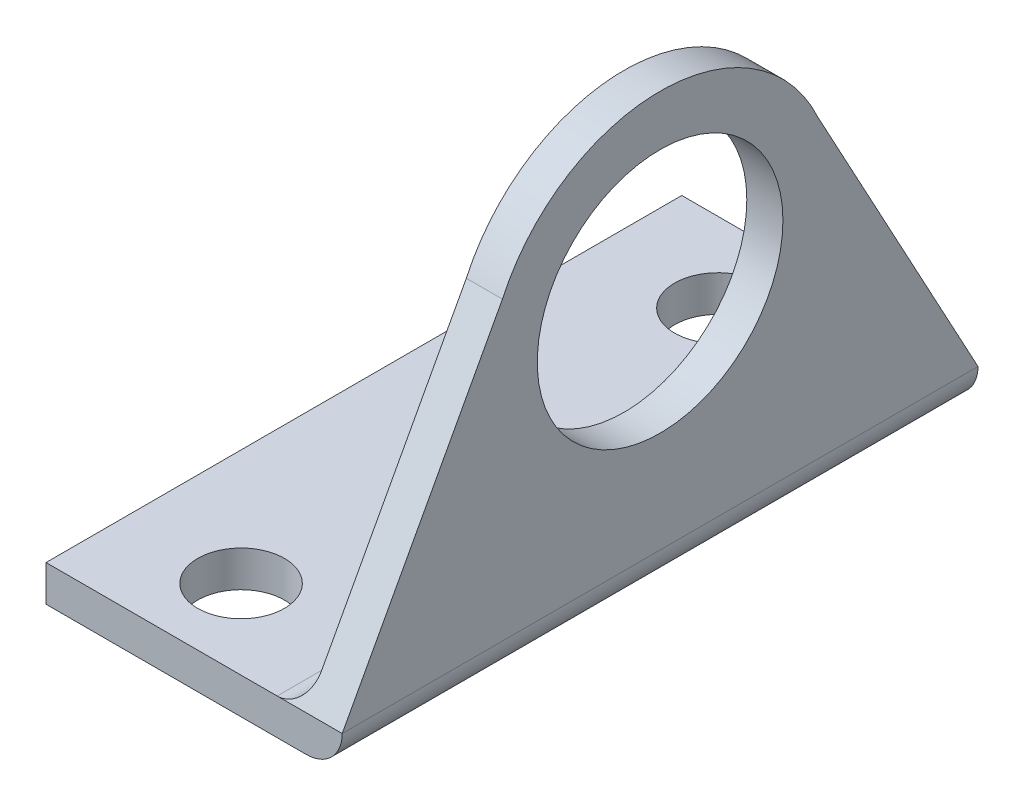
ISO-10303-21;
HEADER;
FILE_DESCRIPTION(('STEP AP214'),'2;1');
FILE_NAME('part.step','',(''),(''),'','','');
FILE_SCHEMA(('AUTOMOTIVE_DESIGN { 1 0 10303 214 1 1 1 1 }'));
ENDSEC;
DATA;
#1=APPLICATION_CONTEXT('core data for automotive mechanical design processes');
#2=APPLICATION_PROTOCOL_DEFINITION('international standard','automotive_design',2000,#1);
#3=PRODUCT_CONTEXT('',#1,'mechanical');
#4=PRODUCT('Part','Part','',(#3));
#5=PRODUCT_RELATED_PRODUCT_CATEGORY('part','',(#4));
#6=PRODUCT_DEFINITION_FORMATION('','',#4);
#7=PRODUCT_DEFINITION_CONTEXT('part definition',#1,'design');
#8=PRODUCT_DEFINITION('design','',#6,#7);
#9=PRODUCT_DEFINITION_SHAPE('','',#8);
#10=(LENGTH_UNIT() NAMED_UNIT(*) SI_UNIT(.MILLI.,.METRE.));
#11=(NAMED_UNIT(*) PLANE_ANGLE_UNIT() SI_UNIT($,.RADIAN.));
#12=(NAMED_UNIT(*) SI_UNIT($,.STERADIAN.) SOLID_ANGLE_UNIT());
#13=UNCERTAINTY_MEASURE_WITH_UNIT(LENGTH_MEASURE(1.E-05),#10,'distance_accuracy_value','');
#14=(GEOMETRIC_REPRESENTATION_CONTEXT(3) GLOBAL_UNCERTAINTY_ASSIGNED_CONTEXT((#13)) GLOBAL_UNIT_ASSIGNED_CONTEXT((#10,
#11,#12)) REPRESENTATION_CONTEXT('',''));
#15=CARTESIAN_POINT('',(0.,0.,0.));
#16=DIRECTION('',(0.,0.,1.));
#17=DIRECTION('',(1.,0.,0.));
#18=AXIS2_PLACEMENT_3D('',#15,#16,#17);
#19=CARTESIAN_POINT('',(9.,0.,0.));
#20=DIRECTION('',(-1.,0.,0.));
#21=DIRECTION('',(0.,0.,1.));
#22=AXIS2_PLACEMENT_3D('',#19,#20,#21);
#23=PLANE('',#22);
#24=CARTESIAN_POINT('',(9.,18.,0.));
#25=DIRECTION('',(1.,0.,0.));
#26=DIRECTION('',(0.,0.,-1.));
#27=AXIS2_PLACEMENT_3D('',#24,#25,#26);
#28=CIRCLE('',#27,8.5);
#29=CARTESIAN_POINT('',(9.,18.,-8.5));
#30=VERTEX_POINT('',#29);
#31=EDGE_CURVE('E235',#30,#30,#28,.T.);
#32=ORIENTED_EDGE('',*,*,#31,.T.);
#33=EDGE_LOOP('',(#32));
#34=FACE_BOUND('',#33,.T.);
#35=DIRECTION('',(0.,0.879510938601281,0.475878670335931));
#36=VECTOR('',#35,1.);
#37=CARTESIAN_POINT('',(9.,9.77404218436638,-18.0642200446435));
#38=LINE('',#37,#36);
#39=CARTESIAN_POINT('',(9.,4.5,-20.9178561642616));
#40=VERTEX_POINT('',#39);
#41=CARTESIAN_POINT('',(9.,22.9916533560188,-10.9125418183482));
#42=VERTEX_POINT('',#41);
#43=EDGE_CURVE('E141',#40,#42,#38,.T.);
#44=ORIENTED_EDGE('',*,*,#43,.F.);
#45=DIRECTION('',(0.,0.,-1.));
#46=VECTOR('',#45,1.);
#47=CARTESIAN_POINT('',(9.,4.5,22.));
#48=LINE('',#47,#46);
#49=CARTESIAN_POINT('',(9.,4.5,20.9178561642616));
#50=VERTEX_POINT('',#49);
#51=EDGE_CURVE('E91',#40,#50,#48,.F.);
#52=ORIENTED_EDGE('',*,*,#51,.T.);
#53=DIRECTION('',(0.,0.879510938601281,-0.475878670335931));
#54=VECTOR('',#53,1.);
#55=CARTESIAN_POINT('',(9.,9.77404218436638,18.0642200446435));
#56=LINE('',#55,#54);
#57=CARTESIAN_POINT('',(9.,22.9916533560188,10.9125418183482));
#58=VERTEX_POINT('',#57);
#59=EDGE_CURVE('E151',#50,#58,#56,.T.);
#60=ORIENTED_EDGE('',*,*,#59,.T.);
#61=CARTESIAN_POINT('',(9.,18.,0.));
#62=DIRECTION('',(1.,0.,0.));
#63=DIRECTION('',(0.,0.,-1.));
#64=AXIS2_PLACEMENT_3D('',#61,#62,#63);
#65=CIRCLE('',#64,12.0000071734917);
#66=EDGE_CURVE('E150',#42,#58,#65,.T.);
#67=ORIENTED_EDGE('',*,*,#66,.F.);
#68=EDGE_LOOP('',(#44,#52,#60,#67));
#69=FACE_BOUND('',#68,.T.);
#70=ADVANCED_FACE('F67',(#34,#69),#23,.T.);
#71=CARTESIAN_POINT('',(11.5,0.,0.));
#72=DIRECTION('',(-1.,0.,0.));
#73=DIRECTION('',(0.,0.,1.));
#74=AXIS2_PLACEMENT_3D('',#71,#72,#73);
#75=PLANE('',#74);
#76=CARTESIAN_POINT('',(11.5,18.,0.));
#77=DIRECTION('',(1.,0.,0.));
#78=DIRECTION('',(0.,0.,-1.));
#79=AXIS2_PLACEMENT_3D('',#76,#77,#78);
#80=CIRCLE('',#79,8.5);
#81=CARTESIAN_POINT('',(11.5,18.,-8.5));
#82=VERTEX_POINT('',#81);
#83=EDGE_CURVE('E237',#82,#82,#80,.T.);
#84=ORIENTED_EDGE('',*,*,#83,.F.);
#85=EDGE_LOOP('',(#84));
#86=FACE_BOUND('',#85,.T.);
#87=DIRECTION('',(0.,0.879510938601281,-0.475878670335931));
#88=VECTOR('',#87,1.);
#89=CARTESIAN_POINT('',(11.5,9.77404218436638,18.0642200446435));
#90=LINE('',#89,#88);
#91=CARTESIAN_POINT('',(11.5,2.5,22.));
#92=VERTEX_POINT('',#91);
#93=CARTESIAN_POINT('',(11.5,22.9916533560188,10.9125418183482));
#94=VERTEX_POINT('',#93);
#95=EDGE_CURVE('E154',#92,#94,#90,.T.);
#96=ORIENTED_EDGE('',*,*,#95,.F.);
#97=DIRECTION('',(0.,0.,-1.));
#98=VECTOR('',#97,1.);
#99=CARTESIAN_POINT('',(11.5,2.5,0.));
#100=LINE('',#99,#98);
#101=CARTESIAN_POINT('',(11.5,2.49999999999997,-22.));
#102=VERTEX_POINT('',#101);
#103=EDGE_CURVE('E202',#92,#102,#100,.T.);
#104=ORIENTED_EDGE('',*,*,#103,.T.);
#105=DIRECTION('',(0.,0.879510938601281,0.475878670335931));
#106=VECTOR('',#105,1.);
#107=CARTESIAN_POINT('',(11.5,9.77404218436638,-18.0642200446435));
#108=LINE('',#107,#106);
#109=CARTESIAN_POINT('',(11.5,22.9916533560188,-10.9125418183482));
#110=VERTEX_POINT('',#109);
#111=EDGE_CURVE('E147',#102,#110,#108,.T.);
#112=ORIENTED_EDGE('',*,*,#111,.T.);
#113=CARTESIAN_POINT('',(11.5,18.,0.));
#114=DIRECTION('',(1.,0.,0.));
#115=DIRECTION('',(0.,0.,-1.));
#116=AXIS2_PLACEMENT_3D('',#113,#114,#115);
#117=CIRCLE('',#116,12.0000071734917);
#118=EDGE_CURVE('E158',#110,#94,#117,.T.);
#119=ORIENTED_EDGE('',*,*,#118,.T.);
#120=EDGE_LOOP('',(#96,#104,#112,#119));
#121=FACE_BOUND('',#120,.T.);
#122=ADVANCED_FACE('F234',(#86,#121),#75,.F.);
#123=CARTESIAN_POINT('',(9.,2.5,-22.));
#124=DIRECTION('',(0.,0.,1.));
#125=DIRECTION('',(1.,0.,0.));
#126=AXIS2_PLACEMENT_3D('',#123,#124,#125);
#127=PLANE('',#126);
#128=DIRECTION('',(1.,0.,0.));
#129=VECTOR('',#128,1.);
#130=CARTESIAN_POINT('',(9.,2.49999999999997,-22.));
#131=LINE('',#130,#129);
#132=CARTESIAN_POINT('',(7.,2.49999999999997,-22.));
#133=VERTEX_POINT('',#132);
#134=EDGE_CURVE('E102',#133,#102,#131,.T.);
#135=ORIENTED_EDGE('',*,*,#134,.T.);
#136=CARTESIAN_POINT('',(9.,2.5,-22.));
#137=DIRECTION('',(0.,0.,1.));
#138=DIRECTION('',(1.,0.,0.));
#139=AXIS2_PLACEMENT_3D('',#136,#137,#138);
#140=CIRCLE('',#139,2.5);
#141=CARTESIAN_POINT('',(9.,0.,-22.));
#142=VERTEX_POINT('',#141);
#143=EDGE_CURVE('E205',#102,#142,#140,.F.);
#144=ORIENTED_EDGE('',*,*,#143,.T.);
#145=DIRECTION('',(-1.,0.,0.));
#146=VECTOR('',#145,1.);
#147=CARTESIAN_POINT('',(9.,0.,-22.));
#148=LINE('',#147,#146);
#149=CARTESIAN_POINT('',(-9.,0.,-22.));
#150=VERTEX_POINT('',#149);
#151=EDGE_CURVE('E187',#142,#150,#148,.T.);
#152=ORIENTED_EDGE('',*,*,#151,.T.);
#153=DIRECTION('',(0.,-1.,0.));
#154=VECTOR('',#153,1.);
#155=CARTESIAN_POINT('',(-9.,2.5,-22.));
#156=LINE('',#155,#154);
#157=CARTESIAN_POINT('',(-9.,2.5,-22.));
#158=VERTEX_POINT('',#157);
#159=EDGE_CURVE('E191',#158,#150,#156,.T.);
#160=ORIENTED_EDGE('',*,*,#159,.F.);
#161=DIRECTION('',(-1.,0.,0.));
#162=VECTOR('',#161,1.);
#163=CARTESIAN_POINT('',(9.,2.5,-22.));
#164=LINE('',#163,#162);
#165=EDGE_CURVE('E189',#133,#158,#164,.T.);
#166=ORIENTED_EDGE('',*,*,#165,.F.);
#167=EDGE_LOOP('',(#135,#144,#152,#160,#166));
#168=FACE_BOUND('',#167,.T.);
#169=ADVANCED_FACE('F221',(#168),#127,.F.);
#170=CARTESIAN_POINT('',(-9.,2.5,22.));
#171=DIRECTION('',(1.,0.,0.));
#172=DIRECTION('',(0.,0.,-1.));
#173=AXIS2_PLACEMENT_3D('',#170,#171,#172);
#174=PLANE('',#173);
#175=DIRECTION('',(0.,0.,1.));
#176=VECTOR('',#175,1.);
#177=CARTESIAN_POINT('',(-9.,0.,22.));
#178=LINE('',#177,#176);
#179=CARTESIAN_POINT('',(-9.,0.,22.));
#180=VERTEX_POINT('',#179);
#181=EDGE_CURVE('E174',#150,#180,#178,.T.);
#182=ORIENTED_EDGE('',*,*,#181,.T.);
#183=DIRECTION('',(0.,-1.,0.));
#184=VECTOR('',#183,1.);
#185=CARTESIAN_POINT('',(-9.,2.5,22.));
#186=LINE('',#185,#184);
#187=CARTESIAN_POINT('',(-9.,2.5,22.));
#188=VERTEX_POINT('',#187);
#189=EDGE_CURVE('E199',#188,#180,#186,.T.);
#190=ORIENTED_EDGE('',*,*,#189,.F.);
#191=DIRECTION('',(0.,0.,1.));
#192=VECTOR('',#191,1.);
#193=CARTESIAN_POINT('',(-9.,2.5,22.));
#194=LINE('',#193,#192);
#195=EDGE_CURVE('E183',#158,#188,#194,.T.);
#196=ORIENTED_EDGE('',*,*,#195,.F.);
#197=ORIENTED_EDGE('',*,*,#159,.T.);
#198=EDGE_LOOP('',(#182,#190,#196,#197));
#199=FACE_BOUND('',#198,.T.);
#200=ADVANCED_FACE('F226',(#199),#174,.F.);
#201=CARTESIAN_POINT('',(9.,2.5,22.));
#202=DIRECTION('',(0.,0.,-1.));
#203=DIRECTION('',(-1.,0.,0.));
#204=AXIS2_PLACEMENT_3D('',#201,#202,#203);
#205=PLANE('',#204);
#206=DIRECTION('',(1.,0.,0.));
#207=VECTOR('',#206,1.);
#208=CARTESIAN_POINT('',(9.,0.,22.));
#209=LINE('',#208,#207);
#210=CARTESIAN_POINT('',(9.,0.,22.));
#211=VERTEX_POINT('',#210);
#212=EDGE_CURVE('E194',#180,#211,#209,.T.);
#213=ORIENTED_EDGE('',*,*,#212,.T.);
#214=CARTESIAN_POINT('',(9.,2.5,22.));
#215=DIRECTION('',(0.,0.,-1.));
#216=DIRECTION('',(-1.,0.,0.));
#217=AXIS2_PLACEMENT_3D('',#214,#215,#216);
#218=CIRCLE('',#217,2.5);
#219=EDGE_CURVE('E208',#211,#92,#218,.F.);
#220=ORIENTED_EDGE('',*,*,#219,.T.);
#221=DIRECTION('',(1.,0.,0.));
#222=VECTOR('',#221,1.);
#223=CARTESIAN_POINT('',(9.,2.5,22.));
#224=LINE('',#223,#222);
#225=CARTESIAN_POINT('',(7.,2.5,22.));
#226=VERTEX_POINT('',#225);
#227=EDGE_CURVE('E82',#226,#92,#224,.T.);
#228=ORIENTED_EDGE('',*,*,#227,.F.);
#229=DIRECTION('',(1.,0.,0.));
#230=VECTOR('',#229,1.);
#231=CARTESIAN_POINT('',(9.,2.5,22.));
#232=LINE('',#231,#230);
#233=EDGE_CURVE('E186',#188,#226,#232,.T.);
#234=ORIENTED_EDGE('',*,*,#233,.F.);
#235=ORIENTED_EDGE('',*,*,#189,.T.);
#236=EDGE_LOOP('',(#213,#220,#228,#234,#235));
#237=FACE_BOUND('',#236,.T.);
#238=ADVANCED_FACE('F227',(#237),#205,.F.);
#239=CARTESIAN_POINT('',(0.,2.5,0.));
#240=DIRECTION('',(0.,1.,0.));
#241=DIRECTION('',(0.,0.,1.));
#242=AXIS2_PLACEMENT_3D('',#239,#240,#241);
#243=PLANE('',#242);
#244=CARTESIAN_POINT('',(-1.,2.5,16.5));
#245=DIRECTION('',(0.,1.,0.));
#246=DIRECTION('',(0.,0.,1.));
#247=AXIS2_PLACEMENT_3D('',#244,#245,#246);
#248=CIRCLE('',#247,3.);
#249=CARTESIAN_POINT('',(-1.,2.5,19.5));
#250=VERTEX_POINT('',#249);
#251=EDGE_CURVE('E175',#250,#250,#248,.T.);
#252=ORIENTED_EDGE('',*,*,#251,.F.);
#253=EDGE_LOOP('',(#252));
#254=FACE_BOUND('',#253,.T.);
#255=CARTESIAN_POINT('',(-1.,2.5,-16.5));
#256=DIRECTION('',(0.,1.,0.));
#257=DIRECTION('',(0.,0.,-1.));
#258=AXIS2_PLACEMENT_3D('',#255,#256,#257);
#259=CIRCLE('',#258,3.);
#260=CARTESIAN_POINT('',(-1.,2.5,-19.5));
#261=VERTEX_POINT('',#260);
#262=EDGE_CURVE('E169',#261,#261,#259,.T.);
#263=ORIENTED_EDGE('',*,*,#262,.F.);
#264=EDGE_LOOP('',(#263));
#265=FACE_BOUND('',#264,.T.);
#266=ORIENTED_EDGE('',*,*,#233,.T.);
#267=DIRECTION('',(0.,0.,-1.));
#268=VECTOR('',#267,1.);
#269=CARTESIAN_POINT('',(7.,2.5,-22.));
#270=LINE('',#269,#268);
#271=EDGE_CURVE('E210',#226,#133,#270,.T.);
#272=ORIENTED_EDGE('',*,*,#271,.T.);
#273=ORIENTED_EDGE('',*,*,#165,.T.);
#274=ORIENTED_EDGE('',*,*,#195,.T.);
#275=EDGE_LOOP('',(#266,#272,#273,#274));
#276=FACE_BOUND('',#275,.T.);
#277=ADVANCED_FACE('F216',(#254,#265,#276),#243,.T.);
#278=CARTESIAN_POINT('',(0.,0.,0.));
#279=DIRECTION('',(0.,1.,0.));
#280=DIRECTION('',(0.,0.,1.));
#281=AXIS2_PLACEMENT_3D('',#278,#279,#280);
#282=PLANE('',#281);
#283=CARTESIAN_POINT('',(-1.,0.,16.5));
#284=DIRECTION('',(0.,1.,0.));
#285=DIRECTION('',(0.,0.,1.));
#286=AXIS2_PLACEMENT_3D('',#283,#284,#285);
#287=CIRCLE('',#286,3.);
#288=CARTESIAN_POINT('',(-1.,0.,19.5));
#289=VERTEX_POINT('',#288);
#290=EDGE_CURVE('E171',#289,#289,#287,.T.);
#291=ORIENTED_EDGE('',*,*,#290,.T.);
#292=EDGE_LOOP('',(#291));
#293=FACE_BOUND('',#292,.T.);
#294=CARTESIAN_POINT('',(-1.,0.,-16.5));
#295=DIRECTION('',(0.,1.,0.));
#296=DIRECTION('',(0.,0.,-1.));
#297=AXIS2_PLACEMENT_3D('',#294,#295,#296);
#298=CIRCLE('',#297,3.);
#299=CARTESIAN_POINT('',(-1.,0.,-19.5));
#300=VERTEX_POINT('',#299);
#301=EDGE_CURVE('E178',#300,#300,#298,.T.);
#302=ORIENTED_EDGE('',*,*,#301,.T.);
#303=EDGE_LOOP('',(#302));
#304=FACE_BOUND('',#303,.T.);
#305=ORIENTED_EDGE('',*,*,#151,.F.);
#306=DIRECTION('',(0.,0.,-1.));
#307=VECTOR('',#306,1.);
#308=CARTESIAN_POINT('',(9.,0.,0.));
#309=LINE('',#308,#307);
#310=EDGE_CURVE('E110',#142,#211,#309,.F.);
#311=ORIENTED_EDGE('',*,*,#310,.T.);
#312=ORIENTED_EDGE('',*,*,#212,.F.);
#313=ORIENTED_EDGE('',*,*,#181,.F.);
#314=EDGE_LOOP('',(#305,#311,#312,#313));
#315=FACE_BOUND('',#314,.T.);
#316=ADVANCED_FACE('F264',(#293,#304,#315),#282,.F.);
#317=CARTESIAN_POINT('',(-1.,0.,-16.5));
#318=DIRECTION('',(0.,1.,0.));
#319=DIRECTION('',(0.,0.,1.));
#320=AXIS2_PLACEMENT_3D('',#317,#318,#319);
#321=CYLINDRICAL_SURFACE('',#320,3.);
#322=ORIENTED_EDGE('',*,*,#301,.F.);
#323=EDGE_LOOP('',(#322));
#324=FACE_BOUND('',#323,.T.);
#325=ORIENTED_EDGE('',*,*,#262,.T.);
#326=EDGE_LOOP('',(#325));
#327=FACE_BOUND('',#326,.T.);
#328=ADVANCED_FACE('F260',(#324,#327),#321,.F.);
#329=CARTESIAN_POINT('',(-1.,0.,16.5));
#330=DIRECTION('',(0.,1.,0.));
#331=DIRECTION('',(0.,0.,1.));
#332=AXIS2_PLACEMENT_3D('',#329,#330,#331);
#333=CYLINDRICAL_SURFACE('',#332,3.);
#334=ORIENTED_EDGE('',*,*,#290,.F.);
#335=EDGE_LOOP('',(#334));
#336=FACE_BOUND('',#335,.T.);
#337=ORIENTED_EDGE('',*,*,#251,.T.);
#338=EDGE_LOOP('',(#337));
#339=FACE_BOUND('',#338,.T.);
#340=ADVANCED_FACE('F257',(#336,#339),#333,.F.);
#341=CARTESIAN_POINT('',(9.,18.,0.));
#342=DIRECTION('',(1.,0.,0.));
#343=DIRECTION('',(0.,0.,-1.));
#344=AXIS2_PLACEMENT_3D('',#341,#342,#343);
#345=CYLINDRICAL_SURFACE('',#344,12.0000071734917);
#346=ORIENTED_EDGE('',*,*,#118,.F.);
#347=DIRECTION('',(1.,0.,0.));
#348=VECTOR('',#347,1.);
#349=CARTESIAN_POINT('',(9.,22.9916533560188,-10.9125418183482));
#350=LINE('',#349,#348);
#351=EDGE_CURVE('E145',#42,#110,#350,.T.);
#352=ORIENTED_EDGE('',*,*,#351,.F.);
#353=ORIENTED_EDGE('',*,*,#66,.T.);
#354=DIRECTION('',(1.,0.,0.));
#355=VECTOR('',#354,1.);
#356=CARTESIAN_POINT('',(9.,22.9916533560188,10.9125418183482));
#357=LINE('',#356,#355);
#358=EDGE_CURVE('E167',#58,#94,#357,.T.);
#359=ORIENTED_EDGE('',*,*,#358,.T.);
#360=EDGE_LOOP('',(#346,#352,#353,#359));
#361=FACE_BOUND('',#360,.T.);
#362=ADVANCED_FACE('F156',(#361),#345,.T.);
#363=CARTESIAN_POINT('',(9.,9.77404218436638,18.0642200446435));
#364=DIRECTION('',(0.,-0.475878670335931,-0.879510938601281));
#365=DIRECTION('',(0.,0.879510938601281,-0.475878670335931));
#366=AXIS2_PLACEMENT_3D('',#363,#364,#365);
#367=PLANE('',#366);
#368=ORIENTED_EDGE('',*,*,#95,.T.);
#369=ORIENTED_EDGE('',*,*,#358,.F.);
#370=ORIENTED_EDGE('',*,*,#59,.F.);
#371=CARTESIAN_POINT('',(7.,4.5,20.9178561642616));
#372=DIRECTION('',(0.,-0.475878670335931,-0.879510938601281));
#373=DIRECTION('',(0.,-0.879510938601281,0.475878670335931));
#374=AXIS2_PLACEMENT_3D('',#371,#372,#373);
#375=ELLIPSE('',#374,2.27399104686597,2.);
#376=EDGE_CURVE('E12',#50,#226,#375,.T.);
#377=ORIENTED_EDGE('',*,*,#376,.T.);
#378=ORIENTED_EDGE('',*,*,#227,.T.);
#379=EDGE_LOOP('',(#368,#369,#370,#377,#378));
#380=FACE_BOUND('',#379,.T.);
#381=ADVANCED_FACE('F285',(#380),#367,.F.);
#382=CARTESIAN_POINT('',(9.,9.77404218436638,-18.0642200446435));
#383=DIRECTION('',(0.,0.475878670335931,-0.879510938601281));
#384=DIRECTION('',(0.,0.879510938601281,0.475878670335931));
#385=AXIS2_PLACEMENT_3D('',#382,#383,#384);
#386=PLANE('',#385);
#387=ORIENTED_EDGE('',*,*,#111,.F.);
#388=ORIENTED_EDGE('',*,*,#134,.F.);
#389=CARTESIAN_POINT('',(7.,4.5,-20.9178561642616));
#390=DIRECTION('',(0.,0.475878670335931,-0.879510938601281));
#391=DIRECTION('',(0.,0.879510938601281,0.475878670335931));
#392=AXIS2_PLACEMENT_3D('',#389,#390,#391);
#393=ELLIPSE('',#392,2.27399104686597,2.);
#394=EDGE_CURVE('E75',#133,#40,#393,.F.);
#395=ORIENTED_EDGE('',*,*,#394,.T.);
#396=ORIENTED_EDGE('',*,*,#43,.T.);
#397=ORIENTED_EDGE('',*,*,#351,.T.);
#398=EDGE_LOOP('',(#387,#388,#395,#396,#397));
#399=FACE_BOUND('',#398,.T.);
#400=ADVANCED_FACE('F143',(#399),#386,.T.);
#401=CARTESIAN_POINT('',(9.,18.,0.));
#402=DIRECTION('',(1.,0.,0.));
#403=DIRECTION('',(0.,0.,-1.));
#404=AXIS2_PLACEMENT_3D('',#401,#402,#403);
#405=CYLINDRICAL_SURFACE('',#404,8.5);
#406=ORIENTED_EDGE('',*,*,#31,.F.);
#407=EDGE_LOOP('',(#406));
#408=FACE_BOUND('',#407,.T.);
#409=ORIENTED_EDGE('',*,*,#83,.T.);
#410=EDGE_LOOP('',(#409));
#411=FACE_BOUND('',#410,.T.);
#412=ADVANCED_FACE('F243',(#408,#411),#405,.F.);
#413=CARTESIAN_POINT('',(9.,2.5,0.));
#414=DIRECTION('',(0.,0.,-1.));
#415=DIRECTION('',(-1.,0.,0.));
#416=AXIS2_PLACEMENT_3D('',#413,#414,#415);
#417=CYLINDRICAL_SURFACE('',#416,2.5);
#418=ORIENTED_EDGE('',*,*,#219,.F.);
#419=ORIENTED_EDGE('',*,*,#310,.F.);
#420=ORIENTED_EDGE('',*,*,#143,.F.);
#421=ORIENTED_EDGE('',*,*,#103,.F.);
#422=EDGE_LOOP('',(#418,#419,#420,#421));
#423=FACE_BOUND('',#422,.T.);
#424=ADVANCED_FACE('F231',(#423),#417,.T.);
#425=CARTESIAN_POINT('',(7.,4.5,0.));
#426=DIRECTION('',(0.,0.,1.));
#427=DIRECTION('',(1.,0.,0.));
#428=AXIS2_PLACEMENT_3D('',#425,#426,#427);
#429=CYLINDRICAL_SURFACE('',#428,2.);
#430=ORIENTED_EDGE('',*,*,#376,.F.);
#431=ORIENTED_EDGE('',*,*,#51,.F.);
#432=ORIENTED_EDGE('',*,*,#394,.F.);
#433=ORIENTED_EDGE('',*,*,#271,.F.);
#434=EDGE_LOOP('',(#430,#431,#432,#433));
#435=FACE_BOUND('',#434,.T.);
#436=ADVANCED_FACE('F69',(#435),#429,.F.);
#437=CLOSED_SHELL('',(#70,#122,#169,#200,#238,#277,#316,#328,#340,#362,#381,#400,#412,#424,#436));
#438=MANIFOLD_SOLID_BREP('B2',#437);
#439=ADVANCED_BREP_SHAPE_REPRESENTATION('',(#18,#438),#14);
#440=SHAPE_DEFINITION_REPRESENTATION(#9,#439);
ENDSEC;
END-ISO-10303-21;
